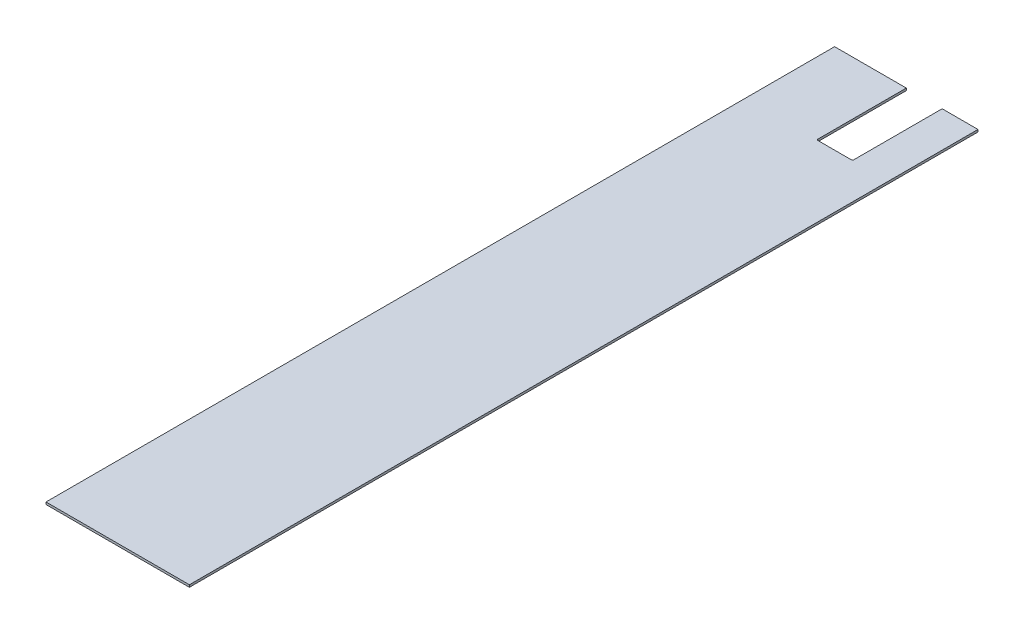
ISO-10303-21;
HEADER;
FILE_DESCRIPTION(('STEP AP214'),'2;1');
FILE_NAME('part.step','',(''),(''),'','','');
FILE_SCHEMA(('AUTOMOTIVE_DESIGN { 1 0 10303 214 1 1 1 1 }'));
ENDSEC;
DATA;
#1=APPLICATION_CONTEXT('core data for automotive mechanical design processes');
#2=APPLICATION_PROTOCOL_DEFINITION('international standard','automotive_design',2000,#1);
#3=PRODUCT_CONTEXT('',#1,'mechanical');
#4=PRODUCT('Part','Part','',(#3));
#5=PRODUCT_RELATED_PRODUCT_CATEGORY('part','',(#4));
#6=PRODUCT_DEFINITION_FORMATION('','',#4);
#7=PRODUCT_DEFINITION_CONTEXT('part definition',#1,'design');
#8=PRODUCT_DEFINITION('design','',#6,#7);
#9=PRODUCT_DEFINITION_SHAPE('','',#8);
#10=(LENGTH_UNIT() NAMED_UNIT(*) SI_UNIT(.MILLI.,.METRE.));
#11=(NAMED_UNIT(*) PLANE_ANGLE_UNIT() SI_UNIT($,.RADIAN.));
#12=(NAMED_UNIT(*) SI_UNIT($,.STERADIAN.) SOLID_ANGLE_UNIT());
#13=UNCERTAINTY_MEASURE_WITH_UNIT(LENGTH_MEASURE(1.E-05),#10,'distance_accuracy_value','');
#14=(GEOMETRIC_REPRESENTATION_CONTEXT(3) GLOBAL_UNCERTAINTY_ASSIGNED_CONTEXT((#13)) GLOBAL_UNIT_ASSIGNED_CONTEXT((#10,
#11,#12)) REPRESENTATION_CONTEXT('',''));
#15=CARTESIAN_POINT('',(0.,0.,0.));
#16=DIRECTION('',(0.,0.,1.));
#17=DIRECTION('',(1.,0.,0.));
#18=AXIS2_PLACEMENT_3D('',#15,#16,#17);
#19=CARTESIAN_POINT('',(203.2,6.35,-1117.6));
#20=DIRECTION('',(-1.,0.,0.));
#21=DIRECTION('',(0.,0.,1.));
#22=AXIS2_PLACEMENT_3D('',#19,#20,#21);
#23=PLANE('',#22);
#24=DIRECTION('',(0.,0.,-1.));
#25=VECTOR('',#24,1.);
#26=CARTESIAN_POINT('',(203.2,0.,-1117.6));
#27=LINE('',#26,#25);
#28=CARTESIAN_POINT('',(203.2,0.,1117.6));
#29=VERTEX_POINT('',#28);
#30=CARTESIAN_POINT('',(203.2,0.,-1117.6));
#31=VERTEX_POINT('',#30);
#32=EDGE_CURVE('E140',#29,#31,#27,.T.);
#33=ORIENTED_EDGE('',*,*,#32,.T.);
#34=DIRECTION('',(0.,-1.,0.));
#35=VECTOR('',#34,1.);
#36=CARTESIAN_POINT('',(203.2,6.35,-1117.6));
#37=LINE('',#36,#35);
#38=CARTESIAN_POINT('',(203.2,6.35,-1117.6));
#39=VERTEX_POINT('',#38);
#40=EDGE_CURVE('E11',#39,#31,#37,.T.);
#41=ORIENTED_EDGE('',*,*,#40,.F.);
#42=DIRECTION('',(0.,0.,-1.));
#43=VECTOR('',#42,1.);
#44=CARTESIAN_POINT('',(203.2,6.35,-1117.6));
#45=LINE('',#44,#43);
#46=CARTESIAN_POINT('',(203.2,6.35,1117.6));
#47=VERTEX_POINT('',#46);
#48=EDGE_CURVE('E158',#47,#39,#45,.T.);
#49=ORIENTED_EDGE('',*,*,#48,.F.);
#50=DIRECTION('',(0.,-1.,0.));
#51=VECTOR('',#50,1.);
#52=CARTESIAN_POINT('',(203.2,6.35,1117.6));
#53=LINE('',#52,#51);
#54=EDGE_CURVE('E136',#47,#29,#53,.T.);
#55=ORIENTED_EDGE('',*,*,#54,.T.);
#56=EDGE_LOOP('',(#33,#41,#49,#55));
#57=FACE_BOUND('',#56,.T.);
#58=ADVANCED_FACE('F32',(#57),#23,.F.);
#59=CARTESIAN_POINT('',(101.6,6.35,-1117.6));
#60=DIRECTION('',(0.,0.,1.));
#61=DIRECTION('',(1.,0.,0.));
#62=AXIS2_PLACEMENT_3D('',#59,#60,#61);
#63=PLANE('',#62);
#64=DIRECTION('',(-1.,0.,0.));
#65=VECTOR('',#64,1.);
#66=CARTESIAN_POINT('',(101.6,0.,-1117.6));
#67=LINE('',#66,#65);
#68=CARTESIAN_POINT('',(101.6,0.,-1117.6));
#69=VERTEX_POINT('',#68);
#70=EDGE_CURVE('E143',#31,#69,#67,.T.);
#71=ORIENTED_EDGE('',*,*,#70,.T.);
#72=DIRECTION('',(0.,-1.,0.));
#73=VECTOR('',#72,1.);
#74=CARTESIAN_POINT('',(101.6,6.35,-1117.6));
#75=LINE('',#74,#73);
#76=CARTESIAN_POINT('',(101.6,6.35,-1117.6));
#77=VERTEX_POINT('',#76);
#78=EDGE_CURVE('E40',#77,#69,#75,.T.);
#79=ORIENTED_EDGE('',*,*,#78,.F.);
#80=DIRECTION('',(-1.,0.,0.));
#81=VECTOR('',#80,1.);
#82=CARTESIAN_POINT('',(101.6,6.35,-1117.6));
#83=LINE('',#82,#81);
#84=EDGE_CURVE('E97',#39,#77,#83,.T.);
#85=ORIENTED_EDGE('',*,*,#84,.F.);
#86=ORIENTED_EDGE('',*,*,#40,.T.);
#87=EDGE_LOOP('',(#71,#79,#85,#86));
#88=FACE_BOUND('',#87,.T.);
#89=ADVANCED_FACE('F207',(#88),#63,.F.);
#90=CARTESIAN_POINT('',(101.6,6.35,-866.775));
#91=DIRECTION('',(1.,0.,0.));
#92=DIRECTION('',(0.,0.,-1.));
#93=AXIS2_PLACEMENT_3D('',#90,#91,#92);
#94=PLANE('',#93);
#95=DIRECTION('',(0.,0.,1.));
#96=VECTOR('',#95,1.);
#97=CARTESIAN_POINT('',(101.6,0.,-866.775));
#98=LINE('',#97,#96);
#99=CARTESIAN_POINT('',(101.6,0.,-866.775));
#100=VERTEX_POINT('',#99);
#101=EDGE_CURVE('E145',#69,#100,#98,.T.);
#102=ORIENTED_EDGE('',*,*,#101,.T.);
#103=DIRECTION('',(0.,-1.,0.));
#104=VECTOR('',#103,1.);
#105=CARTESIAN_POINT('',(101.6,6.35,-866.775));
#106=LINE('',#105,#104);
#107=CARTESIAN_POINT('',(101.6,6.35,-866.775));
#108=VERTEX_POINT('',#107);
#109=EDGE_CURVE('E171',#108,#100,#106,.T.);
#110=ORIENTED_EDGE('',*,*,#109,.F.);
#111=DIRECTION('',(0.,0.,1.));
#112=VECTOR('',#111,1.);
#113=CARTESIAN_POINT('',(101.6,6.35,-866.775));
#114=LINE('',#113,#112);
#115=EDGE_CURVE('E179',#77,#108,#114,.T.);
#116=ORIENTED_EDGE('',*,*,#115,.F.);
#117=ORIENTED_EDGE('',*,*,#78,.T.);
#118=EDGE_LOOP('',(#102,#110,#116,#117));
#119=FACE_BOUND('',#118,.T.);
#120=ADVANCED_FACE('F177',(#119),#94,.F.);
#121=CARTESIAN_POINT('',(98.4249999999997,6.35,-866.775));
#122=DIRECTION('',(0.,-1.,0.));
#123=DIRECTION('',(0.,0.,-1.));
#124=AXIS2_PLACEMENT_3D('',#121,#122,#123);
#125=CYLINDRICAL_SURFACE('',#124,3.17500000000002);
#126=CARTESIAN_POINT('',(98.4249999999997,0.,-866.775));
#127=DIRECTION('',(0.,-1.,0.));
#128=DIRECTION('',(0.,0.,1.));
#129=AXIS2_PLACEMENT_3D('',#126,#127,#128);
#130=CIRCLE('',#129,3.17500000000002);
#131=CARTESIAN_POINT('',(98.4249999999997,0.,-863.6));
#132=VERTEX_POINT('',#131);
#133=EDGE_CURVE('E147',#100,#132,#130,.T.);
#134=ORIENTED_EDGE('',*,*,#133,.T.);
#135=DIRECTION('',(0.,-1.,0.));
#136=VECTOR('',#135,1.);
#137=CARTESIAN_POINT('',(98.4249999999997,6.35,-863.6));
#138=LINE('',#137,#136);
#139=CARTESIAN_POINT('',(98.4249999999997,6.35,-863.6));
#140=VERTEX_POINT('',#139);
#141=EDGE_CURVE('E168',#140,#132,#138,.T.);
#142=ORIENTED_EDGE('',*,*,#141,.F.);
#143=CARTESIAN_POINT('',(98.4249999999997,6.35,-866.775));
#144=DIRECTION('',(0.,-1.,0.));
#145=DIRECTION('',(0.,0.,1.));
#146=AXIS2_PLACEMENT_3D('',#143,#144,#145);
#147=CIRCLE('',#146,3.17500000000002);
#148=EDGE_CURVE('E197',#108,#140,#147,.T.);
#149=ORIENTED_EDGE('',*,*,#148,.F.);
#150=ORIENTED_EDGE('',*,*,#109,.T.);
#151=EDGE_LOOP('',(#134,#142,#149,#150));
#152=FACE_BOUND('',#151,.T.);
#153=ADVANCED_FACE('F188',(#152),#125,.F.);
#154=CARTESIAN_POINT('',(3.17499999999975,6.35,-863.6));
#155=DIRECTION('',(0.,0.,1.));
#156=DIRECTION('',(1.,0.,0.));
#157=AXIS2_PLACEMENT_3D('',#154,#155,#156);
#158=PLANE('',#157);
#159=DIRECTION('',(-1.,0.,0.));
#160=VECTOR('',#159,1.);
#161=CARTESIAN_POINT('',(3.17499999999975,0.,-863.6));
#162=LINE('',#161,#160);
#163=CARTESIAN_POINT('',(3.17499999999975,0.,-863.6));
#164=VERTEX_POINT('',#163);
#165=EDGE_CURVE('E149',#132,#164,#162,.T.);
#166=ORIENTED_EDGE('',*,*,#165,.T.);
#167=DIRECTION('',(0.,-1.,0.));
#168=VECTOR('',#167,1.);
#169=CARTESIAN_POINT('',(3.17499999999975,6.35,-863.6));
#170=LINE('',#169,#168);
#171=CARTESIAN_POINT('',(3.17499999999975,6.35,-863.6));
#172=VERTEX_POINT('',#171);
#173=EDGE_CURVE('E165',#172,#164,#170,.T.);
#174=ORIENTED_EDGE('',*,*,#173,.F.);
#175=DIRECTION('',(-1.,0.,0.));
#176=VECTOR('',#175,1.);
#177=CARTESIAN_POINT('',(3.17499999999975,6.35,-863.6));
#178=LINE('',#177,#176);
#179=EDGE_CURVE('E194',#140,#172,#178,.T.);
#180=ORIENTED_EDGE('',*,*,#179,.F.);
#181=ORIENTED_EDGE('',*,*,#141,.T.);
#182=EDGE_LOOP('',(#166,#174,#180,#181));
#183=FACE_BOUND('',#182,.T.);
#184=ADVANCED_FACE('F192',(#183),#158,.F.);
#185=CARTESIAN_POINT('',(3.17499999999975,6.35,-866.775));
#186=DIRECTION('',(0.,-1.,0.));
#187=DIRECTION('',(0.,0.,-1.));
#188=AXIS2_PLACEMENT_3D('',#185,#186,#187);
#189=CYLINDRICAL_SURFACE('',#188,3.17500000000002);
#190=CARTESIAN_POINT('',(3.17499999999975,0.,-866.775));
#191=DIRECTION('',(0.,-1.,0.));
#192=DIRECTION('',(0.,0.,1.));
#193=AXIS2_PLACEMENT_3D('',#190,#191,#192);
#194=CIRCLE('',#193,3.17500000000002);
#195=CARTESIAN_POINT('',(-2.46330733588707E-13,0.,-866.775));
#196=VERTEX_POINT('',#195);
#197=EDGE_CURVE('E151',#164,#196,#194,.T.);
#198=ORIENTED_EDGE('',*,*,#197,.T.);
#199=DIRECTION('',(0.,-1.,0.));
#200=VECTOR('',#199,1.);
#201=CARTESIAN_POINT('',(-2.46330733588707E-13,6.35,-866.775));
#202=LINE('',#201,#200);
#203=CARTESIAN_POINT('',(-2.46330733588707E-13,6.35,-866.775));
#204=VERTEX_POINT('',#203);
#205=EDGE_CURVE('E162',#204,#196,#202,.T.);
#206=ORIENTED_EDGE('',*,*,#205,.F.);
#207=CARTESIAN_POINT('',(3.17499999999975,6.35,-866.775));
#208=DIRECTION('',(0.,-1.,0.));
#209=DIRECTION('',(0.,0.,1.));
#210=AXIS2_PLACEMENT_3D('',#207,#208,#209);
#211=CIRCLE('',#210,3.17500000000002);
#212=EDGE_CURVE('E196',#172,#204,#211,.T.);
#213=ORIENTED_EDGE('',*,*,#212,.F.);
#214=ORIENTED_EDGE('',*,*,#173,.T.);
#215=EDGE_LOOP('',(#198,#206,#213,#214));
#216=FACE_BOUND('',#215,.T.);
#217=ADVANCED_FACE('F219',(#216),#189,.F.);
#218=CARTESIAN_POINT('',(-2.77555756156289E-13,6.35,-1117.6));
#219=DIRECTION('',(-1.,0.,0.));
#220=DIRECTION('',(0.,0.,1.));
#221=AXIS2_PLACEMENT_3D('',#218,#219,#220);
#222=PLANE('',#221);
#223=DIRECTION('',(0.,0.,-1.));
#224=VECTOR('',#223,1.);
#225=CARTESIAN_POINT('',(-2.77555756156289E-13,0.,-1117.6));
#226=LINE('',#225,#224);
#227=CARTESIAN_POINT('',(-2.77555756156289E-13,0.,-1117.6));
#228=VERTEX_POINT('',#227);
#229=EDGE_CURVE('E153',#196,#228,#226,.T.);
#230=ORIENTED_EDGE('',*,*,#229,.T.);
#231=DIRECTION('',(0.,-1.,0.));
#232=VECTOR('',#231,1.);
#233=CARTESIAN_POINT('',(-2.77555756156289E-13,6.35,-1117.6));
#234=LINE('',#233,#232);
#235=CARTESIAN_POINT('',(-2.77555756156289E-13,6.35,-1117.6));
#236=VERTEX_POINT('',#235);
#237=EDGE_CURVE('E131',#236,#228,#234,.T.);
#238=ORIENTED_EDGE('',*,*,#237,.F.);
#239=DIRECTION('',(0.,0.,-1.));
#240=VECTOR('',#239,1.);
#241=CARTESIAN_POINT('',(-2.77555756156289E-13,6.35,-1117.6));
#242=LINE('',#241,#240);
#243=EDGE_CURVE('E122',#204,#236,#242,.T.);
#244=ORIENTED_EDGE('',*,*,#243,.F.);
#245=ORIENTED_EDGE('',*,*,#205,.T.);
#246=EDGE_LOOP('',(#230,#238,#244,#245));
#247=FACE_BOUND('',#246,.T.);
#248=ADVANCED_FACE('F222',(#247),#222,.F.);
#249=CARTESIAN_POINT('',(-203.2,6.35,-1117.6));
#250=DIRECTION('',(0.,0.,1.));
#251=DIRECTION('',(1.,0.,0.));
#252=AXIS2_PLACEMENT_3D('',#249,#250,#251);
#253=PLANE('',#252);
#254=DIRECTION('',(-1.,0.,0.));
#255=VECTOR('',#254,1.);
#256=CARTESIAN_POINT('',(-203.2,0.,-1117.6));
#257=LINE('',#256,#255);
#258=CARTESIAN_POINT('',(-203.2,0.,-1117.6));
#259=VERTEX_POINT('',#258);
#260=EDGE_CURVE('E130',#228,#259,#257,.T.);
#261=ORIENTED_EDGE('',*,*,#260,.T.);
#262=DIRECTION('',(0.,-1.,0.));
#263=VECTOR('',#262,1.);
#264=CARTESIAN_POINT('',(-203.2,6.35,-1117.6));
#265=LINE('',#264,#263);
#266=CARTESIAN_POINT('',(-203.2,6.35,-1117.6));
#267=VERTEX_POINT('',#266);
#268=EDGE_CURVE('E127',#267,#259,#265,.T.);
#269=ORIENTED_EDGE('',*,*,#268,.F.);
#270=DIRECTION('',(-1.,0.,0.));
#271=VECTOR('',#270,1.);
#272=CARTESIAN_POINT('',(-203.2,6.35,-1117.6));
#273=LINE('',#272,#271);
#274=EDGE_CURVE('E116',#236,#267,#273,.T.);
#275=ORIENTED_EDGE('',*,*,#274,.F.);
#276=ORIENTED_EDGE('',*,*,#237,.T.);
#277=EDGE_LOOP('',(#261,#269,#275,#276));
#278=FACE_BOUND('',#277,.T.);
#279=ADVANCED_FACE('F128',(#278),#253,.F.);
#280=CARTESIAN_POINT('',(-203.2,6.35,-1117.6));
#281=DIRECTION('',(1.,0.,0.));
#282=DIRECTION('',(0.,0.,-1.));
#283=AXIS2_PLACEMENT_3D('',#280,#281,#282);
#284=PLANE('',#283);
#285=DIRECTION('',(0.,0.,1.));
#286=VECTOR('',#285,1.);
#287=CARTESIAN_POINT('',(-203.2,0.,-1117.6));
#288=LINE('',#287,#286);
#289=CARTESIAN_POINT('',(-203.2,0.,1117.6));
#290=VERTEX_POINT('',#289);
#291=EDGE_CURVE('E83',#259,#290,#288,.T.);
#292=ORIENTED_EDGE('',*,*,#291,.T.);
#293=DIRECTION('',(0.,-1.,0.));
#294=VECTOR('',#293,1.);
#295=CARTESIAN_POINT('',(-203.2,6.35,1117.6));
#296=LINE('',#295,#294);
#297=CARTESIAN_POINT('',(-203.2,6.35,1117.6));
#298=VERTEX_POINT('',#297);
#299=EDGE_CURVE('E132',#298,#290,#296,.T.);
#300=ORIENTED_EDGE('',*,*,#299,.F.);
#301=DIRECTION('',(0.,0.,1.));
#302=VECTOR('',#301,1.);
#303=CARTESIAN_POINT('',(-203.2,6.35,-1117.6));
#304=LINE('',#303,#302);
#305=EDGE_CURVE('E120',#267,#298,#304,.T.);
#306=ORIENTED_EDGE('',*,*,#305,.F.);
#307=ORIENTED_EDGE('',*,*,#268,.T.);
#308=EDGE_LOOP('',(#292,#300,#306,#307));
#309=FACE_BOUND('',#308,.T.);
#310=ADVANCED_FACE('F134',(#309),#284,.F.);
#311=CARTESIAN_POINT('',(-203.2,6.35,1117.6));
#312=DIRECTION('',(0.,0.,-1.));
#313=DIRECTION('',(-1.,0.,0.));
#314=AXIS2_PLACEMENT_3D('',#311,#312,#313);
#315=PLANE('',#314);
#316=DIRECTION('',(1.,0.,0.));
#317=VECTOR('',#316,1.);
#318=CARTESIAN_POINT('',(-203.2,0.,1117.6));
#319=LINE('',#318,#317);
#320=EDGE_CURVE('E89',#290,#29,#319,.T.);
#321=ORIENTED_EDGE('',*,*,#320,.T.);
#322=ORIENTED_EDGE('',*,*,#54,.F.);
#323=DIRECTION('',(1.,0.,0.));
#324=VECTOR('',#323,1.);
#325=CARTESIAN_POINT('',(-203.2,6.35,1117.6));
#326=LINE('',#325,#324);
#327=EDGE_CURVE('E48',#298,#47,#326,.T.);
#328=ORIENTED_EDGE('',*,*,#327,.F.);
#329=ORIENTED_EDGE('',*,*,#299,.T.);
#330=EDGE_LOOP('',(#321,#322,#328,#329));
#331=FACE_BOUND('',#330,.T.);
#332=ADVANCED_FACE('F231',(#331),#315,.F.);
#333=CARTESIAN_POINT('',(3.17499999999975,6.35,-866.775));
#334=DIRECTION('',(0.,1.,0.));
#335=DIRECTION('',(0.,0.,1.));
#336=AXIS2_PLACEMENT_3D('',#333,#334,#335);
#337=PLANE('',#336);
#338=ORIENTED_EDGE('',*,*,#48,.T.);
#339=ORIENTED_EDGE('',*,*,#84,.T.);
#340=ORIENTED_EDGE('',*,*,#115,.T.);
#341=ORIENTED_EDGE('',*,*,#148,.T.);
#342=ORIENTED_EDGE('',*,*,#179,.T.);
#343=ORIENTED_EDGE('',*,*,#212,.T.);
#344=ORIENTED_EDGE('',*,*,#243,.T.);
#345=ORIENTED_EDGE('',*,*,#274,.T.);
#346=ORIENTED_EDGE('',*,*,#305,.T.);
#347=ORIENTED_EDGE('',*,*,#327,.T.);
#348=EDGE_LOOP('',(#338,#339,#340,#341,#342,#343,#344,#345,#346,#347));
#349=FACE_BOUND('',#348,.T.);
#350=ADVANCED_FACE('F118',(#349),#337,.T.);
#351=CARTESIAN_POINT('',(3.17499999999975,0.,-866.775));
#352=DIRECTION('',(0.,1.,0.));
#353=DIRECTION('',(0.,0.,1.));
#354=AXIS2_PLACEMENT_3D('',#351,#352,#353);
#355=PLANE('',#354);
#356=ORIENTED_EDGE('',*,*,#32,.F.);
#357=ORIENTED_EDGE('',*,*,#320,.F.);
#358=ORIENTED_EDGE('',*,*,#291,.F.);
#359=ORIENTED_EDGE('',*,*,#260,.F.);
#360=ORIENTED_EDGE('',*,*,#229,.F.);
#361=ORIENTED_EDGE('',*,*,#197,.F.);
#362=ORIENTED_EDGE('',*,*,#165,.F.);
#363=ORIENTED_EDGE('',*,*,#133,.F.);
#364=ORIENTED_EDGE('',*,*,#101,.F.);
#365=ORIENTED_EDGE('',*,*,#70,.F.);
#366=EDGE_LOOP('',(#356,#357,#358,#359,#360,#361,#362,#363,#364,#365));
#367=FACE_BOUND('',#366,.T.);
#368=ADVANCED_FACE('F183',(#367),#355,.F.);
#369=CLOSED_SHELL('',(#58,#89,#120,#153,#184,#217,#248,#279,#310,#332,#350,#368));
#370=MANIFOLD_SOLID_BREP('B2',#369);
#371=ADVANCED_BREP_SHAPE_REPRESENTATION('',(#18,#370),#14);
#372=SHAPE_DEFINITION_REPRESENTATION(#9,#371);
ENDSEC;
END-ISO-10303-21;
